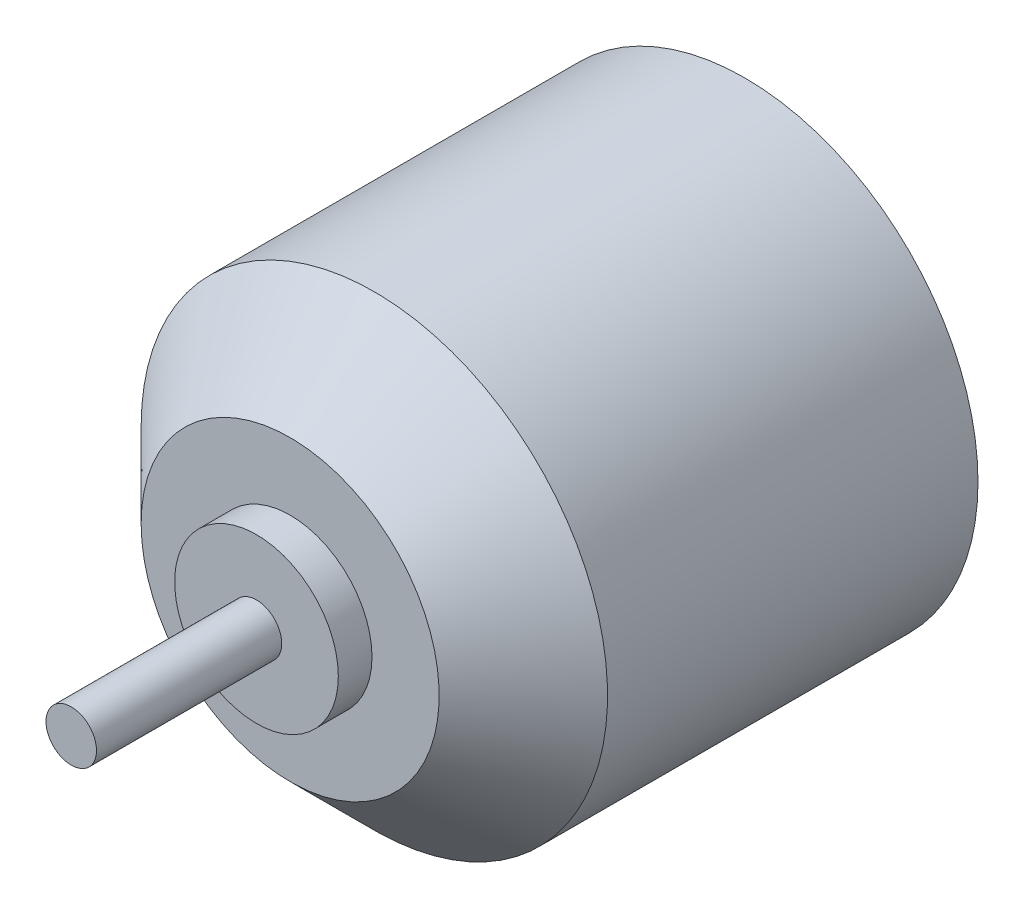
ISO-10303-21;
HEADER;
FILE_DESCRIPTION(('STEP AP214'),'2;1');
FILE_NAME('part.step','',(''),(''),'','','');
FILE_SCHEMA(('AUTOMOTIVE_DESIGN { 1 0 10303 214 1 1 1 1 }'));
ENDSEC;
DATA;
#1=APPLICATION_CONTEXT('core data for automotive mechanical design processes');
#2=APPLICATION_PROTOCOL_DEFINITION('international standard','automotive_design',2000,#1);
#3=PRODUCT_CONTEXT('',#1,'mechanical');
#4=PRODUCT('Part','Part','',(#3));
#5=PRODUCT_RELATED_PRODUCT_CATEGORY('part','',(#4));
#6=PRODUCT_DEFINITION_FORMATION('','',#4);
#7=PRODUCT_DEFINITION_CONTEXT('part definition',#1,'design');
#8=PRODUCT_DEFINITION('design','',#6,#7);
#9=PRODUCT_DEFINITION_SHAPE('','',#8);
#10=(LENGTH_UNIT() NAMED_UNIT(*) SI_UNIT(.MILLI.,.METRE.));
#11=(NAMED_UNIT(*) PLANE_ANGLE_UNIT() SI_UNIT($,.RADIAN.));
#12=(NAMED_UNIT(*) SI_UNIT($,.STERADIAN.) SOLID_ANGLE_UNIT());
#13=UNCERTAINTY_MEASURE_WITH_UNIT(LENGTH_MEASURE(1.E-05),#10,'distance_accuracy_value','');
#14=(GEOMETRIC_REPRESENTATION_CONTEXT(3) GLOBAL_UNCERTAINTY_ASSIGNED_CONTEXT((#13)) GLOBAL_UNIT_ASSIGNED_CONTEXT((#10,
#11,#12)) REPRESENTATION_CONTEXT('',''));
#15=CARTESIAN_POINT('',(0.,0.,0.));
#16=DIRECTION('',(0.,0.,1.));
#17=DIRECTION('',(1.,0.,0.));
#18=AXIS2_PLACEMENT_3D('',#15,#16,#17);
#19=CARTESIAN_POINT('',(0.,0.,27.));
#20=DIRECTION('',(0.,0.,-1.));
#21=DIRECTION('',(-1.,0.,0.));
#22=AXIS2_PLACEMENT_3D('',#19,#20,#21);
#23=CYLINDRICAL_SURFACE('',#22,13.85);
#24=CARTESIAN_POINT('',(0.,0.,22.));
#25=DIRECTION('',(0.,0.,1.));
#26=DIRECTION('',(1.,0.,0.));
#27=AXIS2_PLACEMENT_3D('',#24,#25,#26);
#28=CIRCLE('',#27,13.85);
#29=CARTESIAN_POINT('',(-13.85,0.,22.));
#30=VERTEX_POINT('',#29);
#31=EDGE_CURVE('E10',#30,#30,#28,.F.);
#32=ORIENTED_EDGE('',*,*,#31,.T.);
#33=EDGE_LOOP('',(#32));
#34=FACE_BOUND('',#33,.T.);
#35=CARTESIAN_POINT('',(0.,0.,0.));
#36=DIRECTION('',(0.,0.,1.));
#37=DIRECTION('',(1.,0.,0.));
#38=AXIS2_PLACEMENT_3D('',#35,#36,#37);
#39=CIRCLE('',#38,13.85);
#40=CARTESIAN_POINT('',(13.85,0.,0.));
#41=VERTEX_POINT('',#40);
#42=EDGE_CURVE('E52',#41,#41,#39,.T.);
#43=ORIENTED_EDGE('',*,*,#42,.T.);
#44=EDGE_LOOP('',(#43));
#45=FACE_BOUND('',#44,.T.);
#46=ADVANCED_FACE('F39',(#34,#45),#23,.T.);
#47=CARTESIAN_POINT('',(0.,0.,27.));
#48=DIRECTION('',(0.,0.,1.));
#49=DIRECTION('',(1.,0.,0.));
#50=AXIS2_PLACEMENT_3D('',#47,#48,#49);
#51=PLANE('',#50);
#52=CARTESIAN_POINT('',(0.,0.,27.));
#53=DIRECTION('',(0.,0.,1.));
#54=DIRECTION('',(1.,0.,0.));
#55=AXIS2_PLACEMENT_3D('',#52,#53,#54);
#56=CIRCLE('',#55,4.86020920159883);
#57=CARTESIAN_POINT('',(4.86020920159883,0.,27.));
#58=VERTEX_POINT('',#57);
#59=EDGE_CURVE('E60',#58,#58,#56,.T.);
#60=ORIENTED_EDGE('',*,*,#59,.F.);
#61=EDGE_LOOP('',(#60));
#62=FACE_BOUND('',#61,.T.);
#63=CARTESIAN_POINT('',(0.,0.,27.));
#64=DIRECTION('',(0.,0.,1.));
#65=DIRECTION('',(1.,0.,0.));
#66=AXIS2_PLACEMENT_3D('',#63,#64,#65);
#67=CIRCLE('',#66,8.85);
#68=CARTESIAN_POINT('',(-8.85,0.,27.));
#69=VERTEX_POINT('',#68);
#70=EDGE_CURVE('E48',#69,#69,#67,.T.);
#71=ORIENTED_EDGE('',*,*,#70,.T.);
#72=EDGE_LOOP('',(#71));
#73=FACE_BOUND('',#72,.T.);
#74=ADVANCED_FACE('F88',(#62,#73),#51,.T.);
#75=CARTESIAN_POINT('',(0.,0.,0.));
#76=DIRECTION('',(0.,0.,1.));
#77=DIRECTION('',(1.,0.,0.));
#78=AXIS2_PLACEMENT_3D('',#75,#76,#77);
#79=PLANE('',#78);
#80=ORIENTED_EDGE('',*,*,#42,.F.);
#81=EDGE_LOOP('',(#80));
#82=FACE_BOUND('',#81,.T.);
#83=ADVANCED_FACE('F94',(#82),#79,.F.);
#84=CARTESIAN_POINT('',(0.,0.,27.));
#85=DIRECTION('',(0.,0.,-1.));
#86=DIRECTION('',(-1.,0.,0.));
#87=AXIS2_PLACEMENT_3D('',#84,#85,#86);
#88=CONICAL_SURFACE('',#87,8.85,0.785398163397446);
#89=CARTESIAN_POINT('',(-13.85,0.,22.));
#90=CARTESIAN_POINT('',(-13.7979166666667,0.,22.0520833333333));
#91=CARTESIAN_POINT('',(-13.7458333333333,0.,22.1041666666666));
#92=CARTESIAN_POINT('',(-13.6416666666667,0.,22.2083333333333));
#93=CARTESIAN_POINT('',(-13.5895833333333,0.,22.2604166666666));
#94=CARTESIAN_POINT('',(-13.4854166666667,0.,22.3645833333333));
#95=CARTESIAN_POINT('',(-13.4333333333333,0.,22.4166666666666));
#96=CARTESIAN_POINT('',(-13.3291666666667,0.,22.5208333333333));
#97=CARTESIAN_POINT('',(-13.2770833333333,0.,22.5729166666666));
#98=CARTESIAN_POINT('',(-13.1729166666667,0.,22.6770833333333));
#99=CARTESIAN_POINT('',(-13.1208333333333,0.,22.7291666666666));
#100=CARTESIAN_POINT('',(-13.0166666666667,0.,22.8333333333333));
#101=CARTESIAN_POINT('',(-12.9645833333333,0.,22.8854166666666));
#102=CARTESIAN_POINT('',(-12.8604166666667,0.,22.9895833333333));
#103=CARTESIAN_POINT('',(-12.8083333333333,0.,23.0416666666666));
#104=CARTESIAN_POINT('',(-12.7041666666667,0.,23.1458333333333));
#105=CARTESIAN_POINT('',(-12.6520833333333,0.,23.1979166666666));
#106=CARTESIAN_POINT('',(-12.5479166666667,0.,23.3020833333333));
#107=CARTESIAN_POINT('',(-12.4958333333333,0.,23.3541666666666));
#108=CARTESIAN_POINT('',(-12.3916666666667,0.,23.4583333333333));
#109=CARTESIAN_POINT('',(-12.3395833333333,0.,23.5104166666666));
#110=CARTESIAN_POINT('',(-12.2354166666667,0.,23.6145833333333));
#111=CARTESIAN_POINT('',(-12.1833333333333,0.,23.6666666666667));
#112=CARTESIAN_POINT('',(-12.0791666666667,0.,23.7708333333333));
#113=CARTESIAN_POINT('',(-12.0270833333333,0.,23.8229166666667));
#114=CARTESIAN_POINT('',(-11.9229166666667,0.,23.9270833333333));
#115=CARTESIAN_POINT('',(-11.8708333333333,0.,23.9791666666667));
#116=CARTESIAN_POINT('',(-11.7666666666667,0.,24.0833333333333));
#117=CARTESIAN_POINT('',(-11.7145833333333,0.,24.1354166666667));
#118=CARTESIAN_POINT('',(-11.6104166666667,0.,24.2395833333333));
#119=CARTESIAN_POINT('',(-11.5583333333333,0.,24.2916666666667));
#120=CARTESIAN_POINT('',(-11.4541666666667,0.,24.3958333333333));
#121=CARTESIAN_POINT('',(-11.4020833333333,0.,24.4479166666667));
#122=CARTESIAN_POINT('',(-11.2979166666667,0.,24.5520833333333));
#123=CARTESIAN_POINT('',(-11.2458333333333,0.,24.6041666666667));
#124=CARTESIAN_POINT('',(-11.1416666666667,0.,24.7083333333333));
#125=CARTESIAN_POINT('',(-11.0895833333333,0.,24.7604166666667));
#126=CARTESIAN_POINT('',(-10.9854166666667,0.,24.8645833333333));
#127=CARTESIAN_POINT('',(-10.9333333333333,0.,24.9166666666667));
#128=CARTESIAN_POINT('',(-10.8291666666667,0.,25.0208333333333));
#129=CARTESIAN_POINT('',(-10.7770833333333,0.,25.0729166666667));
#130=CARTESIAN_POINT('',(-10.6729166666667,0.,25.1770833333333));
#131=CARTESIAN_POINT('',(-10.6208333333333,0.,25.2291666666667));
#132=CARTESIAN_POINT('',(-10.5166666666667,0.,25.3333333333333));
#133=CARTESIAN_POINT('',(-10.4645833333333,0.,25.3854166666667));
#134=CARTESIAN_POINT('',(-10.3604166666667,0.,25.4895833333333));
#135=CARTESIAN_POINT('',(-10.3083333333333,0.,25.5416666666667));
#136=CARTESIAN_POINT('',(-10.2041666666667,0.,25.6458333333333));
#137=CARTESIAN_POINT('',(-10.1520833333333,0.,25.6979166666667));
#138=CARTESIAN_POINT('',(-10.0479166666667,0.,25.8020833333333));
#139=CARTESIAN_POINT('',(-9.99583333333333,0.,25.8541666666667));
#140=CARTESIAN_POINT('',(-9.89166666666667,0.,25.9583333333333));
#141=CARTESIAN_POINT('',(-9.83958333333333,0.,26.0104166666667));
#142=CARTESIAN_POINT('',(-9.73541666666667,0.,26.1145833333333));
#143=CARTESIAN_POINT('',(-9.68333333333333,0.,26.1666666666667));
#144=CARTESIAN_POINT('',(-9.57916666666667,0.,26.2708333333333));
#145=CARTESIAN_POINT('',(-9.52708333333333,0.,26.3229166666667));
#146=CARTESIAN_POINT('',(-9.42291666666667,0.,26.4270833333333));
#147=CARTESIAN_POINT('',(-9.37083333333333,0.,26.4791666666667));
#148=CARTESIAN_POINT('',(-9.26666666666667,0.,26.5833333333333));
#149=CARTESIAN_POINT('',(-9.21458333333333,0.,26.6354166666667));
#150=CARTESIAN_POINT('',(-9.11041666666667,0.,26.7395833333333));
#151=CARTESIAN_POINT('',(-9.05833333333333,0.,26.7916666666667));
#152=CARTESIAN_POINT('',(-8.95416666666666,0.,26.8958333333333));
#153=CARTESIAN_POINT('',(-8.90208333333333,0.,26.9479166666667));
#154=CARTESIAN_POINT('',(-8.85,0.,27.));
#155=B_SPLINE_CURVE_WITH_KNOTS('',3,(#89,#90,#91,#92,#93,#94,#95,#96,#97,#98,#99,#100,#101,#102,
#103,#104,#105,#106,#107,#108,#109,#110,#111,#112,#113,#114,#115,#116,#117,#118,#119,#120,#121,
#122,#123,#124,#125,#126,#127,#128,#129,#130,#131,#132,#133,#134,#135,#136,#137,#138,#139,#140,
#141,#142,#143,#144,#145,#146,#147,#148,#149,#150,#151,#152,#153,#154),.UNSPECIFIED.,.F.,.F.,(4,
2,2,2,2,2,2,2,2,2,2,2,2,2,2,2,2,2,2,2,2,2,2,2,2,2,2,2,2,2,2,2,4),(0.,0.220970869120796,
0.441941738241593,0.662912607362389,0.883883476483188,1.10485434560398,1.32582521472478,
1.54679608384558,1.76776695296637,1.98873782208717,2.20970869120797,2.43067956032876,
2.65165042944956,2.87262129857036,3.09359216769115,3.31456303681195,3.53553390593275,
3.75650477505354,3.97747564417434,4.19844651329513,4.41941738241593,4.64038825153673,
4.86135912065753,5.08232998977832,5.30330085889912,5.52427172801992,5.74524259714071,
5.96621346626151,6.18718433538231,6.4081552045031,6.6291260736239,6.85009694274469,
7.07106781186549),.UNSPECIFIED.);
#156=EDGE_CURVE('BSEAM42',#30,#69,#155,.T.);
#157=ORIENTED_EDGE('',*,*,#31,.F.);
#158=ORIENTED_EDGE('',*,*,#70,.F.);
#159=ORIENTED_EDGE('',*,*,#156,.T.);
#160=ORIENTED_EDGE('',*,*,#156,.F.);
#161=EDGE_LOOP('',(#157,#159,#158,#160));
#162=FACE_BOUND('',#161,.T.);
#163=ADVANCED_FACE('F42',(#162),#88,.T.);
#164=CARTESIAN_POINT('',(0.,0.,29.));
#165=DIRECTION('',(0.,0.,-1.));
#166=DIRECTION('',(-1.,0.,0.));
#167=AXIS2_PLACEMENT_3D('',#164,#165,#166);
#168=CYLINDRICAL_SURFACE('',#167,4.86020920159883);
#169=CARTESIAN_POINT('',(0.,0.,29.));
#170=DIRECTION('',(0.,0.,1.));
#171=DIRECTION('',(1.,0.,0.));
#172=AXIS2_PLACEMENT_3D('',#169,#170,#171);
#173=CIRCLE('',#172,4.86020920159883);
#174=CARTESIAN_POINT('',(4.86020920159883,0.,29.));
#175=VERTEX_POINT('',#174);
#176=EDGE_CURVE('E63',#175,#175,#173,.T.);
#177=ORIENTED_EDGE('',*,*,#176,.F.);
#178=EDGE_LOOP('',(#177));
#179=FACE_BOUND('',#178,.T.);
#180=ORIENTED_EDGE('',*,*,#59,.T.);
#181=EDGE_LOOP('',(#180));
#182=FACE_BOUND('',#181,.T.);
#183=ADVANCED_FACE('F76',(#179,#182),#168,.T.);
#184=CARTESIAN_POINT('',(0.,0.,29.));
#185=DIRECTION('',(0.,0.,1.));
#186=DIRECTION('',(1.,0.,0.));
#187=AXIS2_PLACEMENT_3D('',#184,#185,#186);
#188=PLANE('',#187);
#189=CARTESIAN_POINT('',(0.,0.,29.));
#190=DIRECTION('',(0.,0.,1.));
#191=DIRECTION('',(1.,0.,0.));
#192=AXIS2_PLACEMENT_3D('',#189,#190,#191);
#193=CIRCLE('',#192,1.5);
#194=CARTESIAN_POINT('',(-1.5,0.,29.));
#195=VERTEX_POINT('',#194);
#196=EDGE_CURVE('E44',#195,#195,#193,.T.);
#197=ORIENTED_EDGE('',*,*,#196,.F.);
#198=EDGE_LOOP('',(#197));
#199=FACE_BOUND('',#198,.T.);
#200=ORIENTED_EDGE('',*,*,#176,.T.);
#201=EDGE_LOOP('',(#200));
#202=FACE_BOUND('',#201,.T.);
#203=ADVANCED_FACE('F73',(#199,#202),#188,.T.);
#204=CARTESIAN_POINT('',(0.,0.,40.));
#205=DIRECTION('',(0.,0.,1.));
#206=DIRECTION('',(1.,0.,0.));
#207=AXIS2_PLACEMENT_3D('',#204,#205,#206);
#208=PLANE('',#207);
#209=CARTESIAN_POINT('',(0.,0.,40.));
#210=DIRECTION('',(0.,0.,1.));
#211=DIRECTION('',(1.,0.,0.));
#212=AXIS2_PLACEMENT_3D('',#209,#210,#211);
#213=CIRCLE('',#212,1.5);
#214=CARTESIAN_POINT('',(-1.5,0.,40.));
#215=VERTEX_POINT('',#214);
#216=EDGE_CURVE('E57',#215,#215,#213,.T.);
#217=ORIENTED_EDGE('',*,*,#216,.T.);
#218=EDGE_LOOP('',(#217));
#219=FACE_BOUND('',#218,.T.);
#220=ADVANCED_FACE('F75',(#219),#208,.T.);
#221=CARTESIAN_POINT('',(0.,0.,40.));
#222=DIRECTION('',(0.,0.,-1.));
#223=DIRECTION('',(-1.,0.,0.));
#224=AXIS2_PLACEMENT_3D('',#221,#222,#223);
#225=CYLINDRICAL_SURFACE('',#224,1.5);
#226=CARTESIAN_POINT('',(-1.5,0.,29.));
#227=CARTESIAN_POINT('',(-1.5,0.,29.1145833333333));
#228=CARTESIAN_POINT('',(-1.5,0.,29.2291666666667));
#229=CARTESIAN_POINT('',(-1.5,0.,29.4583333333333));
#230=CARTESIAN_POINT('',(-1.5,0.,29.5729166666667));
#231=CARTESIAN_POINT('',(-1.5,0.,29.8020833333333));
#232=CARTESIAN_POINT('',(-1.5,0.,29.9166666666667));
#233=CARTESIAN_POINT('',(-1.5,0.,30.1458333333333));
#234=CARTESIAN_POINT('',(-1.5,0.,30.2604166666667));
#235=CARTESIAN_POINT('',(-1.5,0.,30.4895833333333));
#236=CARTESIAN_POINT('',(-1.5,0.,30.6041666666667));
#237=CARTESIAN_POINT('',(-1.5,0.,30.8333333333333));
#238=CARTESIAN_POINT('',(-1.5,0.,30.9479166666667));
#239=CARTESIAN_POINT('',(-1.5,0.,31.1770833333333));
#240=CARTESIAN_POINT('',(-1.5,0.,31.2916666666667));
#241=CARTESIAN_POINT('',(-1.5,0.,31.5208333333333));
#242=CARTESIAN_POINT('',(-1.5,0.,31.6354166666667));
#243=CARTESIAN_POINT('',(-1.5,0.,31.8645833333333));
#244=CARTESIAN_POINT('',(-1.5,0.,31.9791666666667));
#245=CARTESIAN_POINT('',(-1.5,0.,32.2083333333333));
#246=CARTESIAN_POINT('',(-1.5,0.,32.3229166666667));
#247=CARTESIAN_POINT('',(-1.5,0.,32.5520833333333));
#248=CARTESIAN_POINT('',(-1.5,0.,32.6666666666667));
#249=CARTESIAN_POINT('',(-1.5,0.,32.8958333333333));
#250=CARTESIAN_POINT('',(-1.5,0.,33.0104166666667));
#251=CARTESIAN_POINT('',(-1.5,0.,33.2395833333333));
#252=CARTESIAN_POINT('',(-1.5,0.,33.3541666666667));
#253=CARTESIAN_POINT('',(-1.5,0.,33.5833333333333));
#254=CARTESIAN_POINT('',(-1.5,0.,33.6979166666667));
#255=CARTESIAN_POINT('',(-1.5,0.,33.9270833333333));
#256=CARTESIAN_POINT('',(-1.5,0.,34.0416666666667));
#257=CARTESIAN_POINT('',(-1.5,0.,34.2708333333333));
#258=CARTESIAN_POINT('',(-1.5,0.,34.3854166666667));
#259=CARTESIAN_POINT('',(-1.5,0.,34.6145833333333));
#260=CARTESIAN_POINT('',(-1.5,0.,34.7291666666667));
#261=CARTESIAN_POINT('',(-1.5,0.,34.9583333333333));
#262=CARTESIAN_POINT('',(-1.5,0.,35.0729166666667));
#263=CARTESIAN_POINT('',(-1.5,0.,35.3020833333333));
#264=CARTESIAN_POINT('',(-1.5,0.,35.4166666666667));
#265=CARTESIAN_POINT('',(-1.5,0.,35.6458333333333));
#266=CARTESIAN_POINT('',(-1.5,0.,35.7604166666667));
#267=CARTESIAN_POINT('',(-1.5,0.,35.9895833333333));
#268=CARTESIAN_POINT('',(-1.5,0.,36.1041666666667));
#269=CARTESIAN_POINT('',(-1.5,0.,36.3333333333333));
#270=CARTESIAN_POINT('',(-1.5,0.,36.4479166666667));
#271=CARTESIAN_POINT('',(-1.5,0.,36.6770833333333));
#272=CARTESIAN_POINT('',(-1.5,0.,36.7916666666667));
#273=CARTESIAN_POINT('',(-1.5,0.,37.0208333333333));
#274=CARTESIAN_POINT('',(-1.5,0.,37.1354166666667));
#275=CARTESIAN_POINT('',(-1.5,0.,37.3645833333333));
#276=CARTESIAN_POINT('',(-1.5,0.,37.4791666666667));
#277=CARTESIAN_POINT('',(-1.5,0.,37.7083333333333));
#278=CARTESIAN_POINT('',(-1.5,0.,37.8229166666667));
#279=CARTESIAN_POINT('',(-1.5,0.,38.0520833333333));
#280=CARTESIAN_POINT('',(-1.5,0.,38.1666666666667));
#281=CARTESIAN_POINT('',(-1.5,0.,38.3958333333333));
#282=CARTESIAN_POINT('',(-1.5,0.,38.5104166666667));
#283=CARTESIAN_POINT('',(-1.5,0.,38.7395833333333));
#284=CARTESIAN_POINT('',(-1.5,0.,38.8541666666667));
#285=CARTESIAN_POINT('',(-1.5,0.,39.0833333333333));
#286=CARTESIAN_POINT('',(-1.5,0.,39.1979166666667));
#287=CARTESIAN_POINT('',(-1.5,0.,39.4270833333333));
#288=CARTESIAN_POINT('',(-1.5,0.,39.5416666666667));
#289=CARTESIAN_POINT('',(-1.5,0.,39.7708333333333));
#290=CARTESIAN_POINT('',(-1.5,0.,39.8854166666667));
#291=CARTESIAN_POINT('',(-1.5,0.,40.));
#292=B_SPLINE_CURVE_WITH_KNOTS('',3,(#226,#227,#228,#229,#230,#231,#232,#233,#234,#235,#236,
#237,#238,#239,#240,#241,#242,#243,#244,#245,#246,#247,#248,#249,#250,#251,#252,#253,#254,#255,
#256,#257,#258,#259,#260,#261,#262,#263,#264,#265,#266,#267,#268,#269,#270,#271,#272,#273,#274,
#275,#276,#277,#278,#279,#280,#281,#282,#283,#284,#285,#286,#287,#288,#289,#290,#291),
.UNSPECIFIED.,.F.,.F.,(4,2,2,2,2,2,2,2,2,2,2,2,2,2,2,2,2,2,2,2,2,2,2,2,2,2,2,2,2,2,2,2,4),(0.,
0.343749999999997,0.687500000000001,1.03125,1.375,1.71875,2.0625,2.40625,2.75,3.09375,3.4375,
3.78125,4.125,4.46875,4.8125,5.15625,5.5,5.84375,6.1875,6.53125,6.875,7.21875,7.5625,7.90625,
8.25,8.59375,8.9375,9.28125,9.625,9.96875,10.3125,10.65625,11.),.UNSPECIFIED.);
#293=EDGE_CURVE('BSEAM70',#195,#215,#292,.T.);
#294=ORIENTED_EDGE('',*,*,#196,.T.);
#295=ORIENTED_EDGE('',*,*,#216,.F.);
#296=ORIENTED_EDGE('',*,*,#293,.T.);
#297=ORIENTED_EDGE('',*,*,#293,.F.);
#298=EDGE_LOOP('',(#294,#296,#295,#297));
#299=FACE_BOUND('',#298,.T.);
#300=ADVANCED_FACE('F70',(#299),#225,.T.);
#301=CLOSED_SHELL('',(#46,#74,#83,#163,#183,#203,#220,#300));
#302=MANIFOLD_SOLID_BREP('B2',#301);
#303=ADVANCED_BREP_SHAPE_REPRESENTATION('',(#18,#302),#14);
#304=SHAPE_DEFINITION_REPRESENTATION(#9,#303);
ENDSEC;
END-ISO-10303-21;
